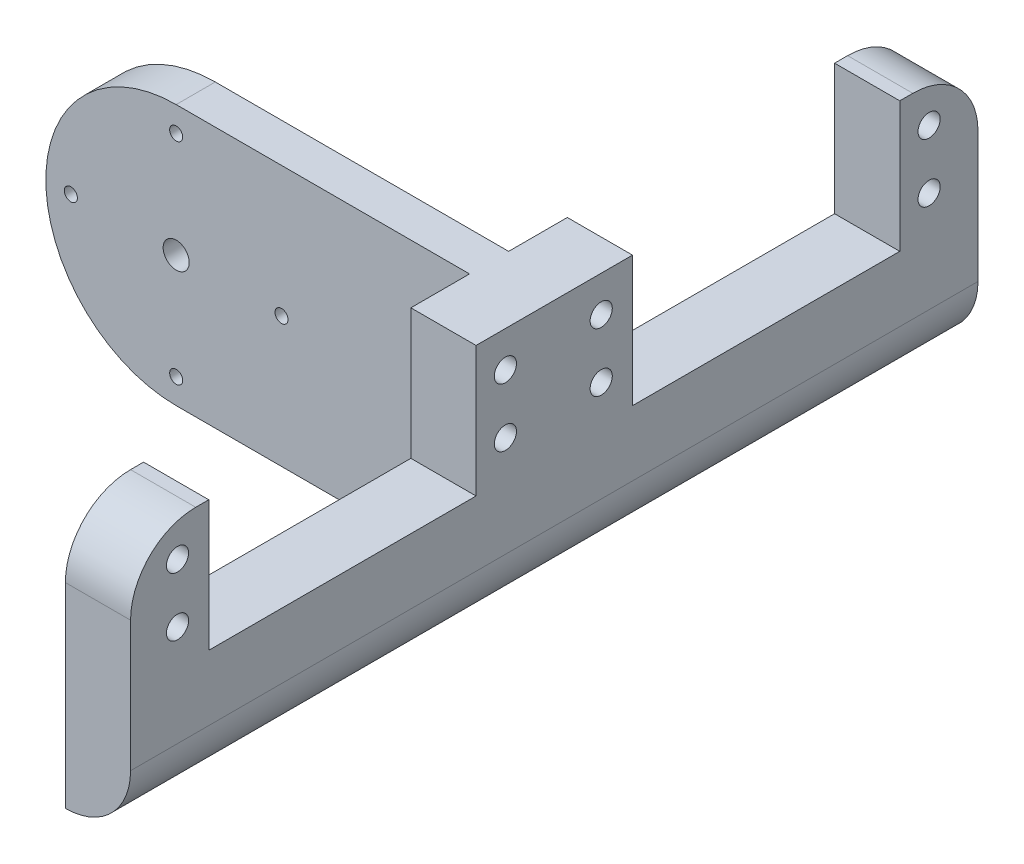
ISO-10303-21;
HEADER;
FILE_DESCRIPTION(('STEP AP214'),'2;1');
FILE_NAME('part.step','',(''),(''),'','','');
FILE_SCHEMA(('AUTOMOTIVE_DESIGN { 1 0 10303 214 1 1 1 1 }'));
ENDSEC;
DATA;
#1=APPLICATION_CONTEXT('core data for automotive mechanical design processes');
#2=APPLICATION_PROTOCOL_DEFINITION('international standard','automotive_design',2000,#1);
#3=PRODUCT_CONTEXT('',#1,'mechanical');
#4=PRODUCT('Part','Part','',(#3));
#5=PRODUCT_RELATED_PRODUCT_CATEGORY('part','',(#4));
#6=PRODUCT_DEFINITION_FORMATION('','',#4);
#7=PRODUCT_DEFINITION_CONTEXT('part definition',#1,'design');
#8=PRODUCT_DEFINITION('design','',#6,#7);
#9=PRODUCT_DEFINITION_SHAPE('','',#8);
#10=(LENGTH_UNIT() NAMED_UNIT(*) SI_UNIT(.MILLI.,.METRE.));
#11=(NAMED_UNIT(*) PLANE_ANGLE_UNIT() SI_UNIT($,.RADIAN.));
#12=(NAMED_UNIT(*) SI_UNIT($,.STERADIAN.) SOLID_ANGLE_UNIT());
#13=UNCERTAINTY_MEASURE_WITH_UNIT(LENGTH_MEASURE(1.E-05),#10,'distance_accuracy_value','');
#14=(GEOMETRIC_REPRESENTATION_CONTEXT(3) GLOBAL_UNCERTAINTY_ASSIGNED_CONTEXT((#13)) GLOBAL_UNIT_ASSIGNED_CONTEXT((#10,
#11,#12)) REPRESENTATION_CONTEXT('',''));
#15=CARTESIAN_POINT('',(0.,0.,0.));
#16=DIRECTION('',(0.,0.,1.));
#17=DIRECTION('',(1.,0.,0.));
#18=AXIS2_PLACEMENT_3D('',#15,#16,#17);
#19=CARTESIAN_POINT('',(55.,0.,0.));
#20=DIRECTION('',(-1.,0.,0.));
#21=DIRECTION('',(0.,0.,1.));
#22=AXIS2_PLACEMENT_3D('',#19,#20,#21);
#23=PLANE('',#22);
#24=CARTESIAN_POINT('',(55.,5.49999999999998,-57.5000000000002));
#25=DIRECTION('',(1.,0.,0.));
#26=DIRECTION('',(0.,0.,-1.));
#27=AXIS2_PLACEMENT_3D('',#24,#25,#26);
#28=CIRCLE('',#27,1.69999999999999);
#29=CARTESIAN_POINT('',(55.,5.49999999999998,-59.2000000000002));
#30=VERTEX_POINT('',#29);
#31=EDGE_CURVE('E737',#30,#30,#28,.T.);
#32=ORIENTED_EDGE('',*,*,#31,.F.);
#33=EDGE_LOOP('',(#32));
#34=FACE_BOUND('',#33,.T.);
#35=DIRECTION('',(0.,1.,0.));
#36=VECTOR('',#35,1.);
#37=CARTESIAN_POINT('',(55.,20.,-65.));
#38=LINE('',#37,#36);
#39=CARTESIAN_POINT('',(55.,-10.,-65.));
#40=VERTEX_POINT('',#39);
#41=CARTESIAN_POINT('',(55.,10.,-65.));
#42=VERTEX_POINT('',#41);
#43=EDGE_CURVE('E227',#40,#42,#38,.T.);
#44=ORIENTED_EDGE('',*,*,#43,.T.);
#45=CARTESIAN_POINT('',(55.,10.,-55.));
#46=DIRECTION('',(-1.,0.,0.));
#47=DIRECTION('',(0.,0.,1.));
#48=AXIS2_PLACEMENT_3D('',#45,#46,#47);
#49=CIRCLE('',#48,10.);
#50=CARTESIAN_POINT('',(55.,20.,-55.));
#51=VERTEX_POINT('',#50);
#52=EDGE_CURVE('E325',#42,#51,#49,.F.);
#53=ORIENTED_EDGE('',*,*,#52,.T.);
#54=DIRECTION('',(0.,0.,1.));
#55=VECTOR('',#54,1.);
#56=CARTESIAN_POINT('',(55.,20.,-65.));
#57=LINE('',#56,#55);
#58=CARTESIAN_POINT('',(55.,20.,-53.));
#59=VERTEX_POINT('',#58);
#60=EDGE_CURVE('E232',#51,#59,#57,.T.);
#61=ORIENTED_EDGE('',*,*,#60,.T.);
#62=DIRECTION('',(0.,1.,0.));
#63=VECTOR('',#62,1.);
#64=CARTESIAN_POINT('',(55.,0.,-53.));
#65=LINE('',#64,#63);
#66=CARTESIAN_POINT('',(55.,0.,-53.));
#67=VERTEX_POINT('',#66);
#68=EDGE_CURVE('E186',#67,#59,#65,.T.);
#69=ORIENTED_EDGE('',*,*,#68,.F.);
#70=DIRECTION('',(0.,0.,-1.));
#71=VECTOR('',#70,1.);
#72=CARTESIAN_POINT('',(55.,0.,-53.));
#73=LINE('',#72,#71);
#74=CARTESIAN_POINT('',(55.,0.,-12.));
#75=VERTEX_POINT('',#74);
#76=EDGE_CURVE('E166',#75,#67,#73,.T.);
#77=ORIENTED_EDGE('',*,*,#76,.F.);
#78=DIRECTION('',(0.,-1.,0.));
#79=VECTOR('',#78,1.);
#80=CARTESIAN_POINT('',(55.,0.,-12.));
#81=LINE('',#80,#79);
#82=CARTESIAN_POINT('',(55.,20.,-12.));
#83=VERTEX_POINT('',#82);
#84=EDGE_CURVE('E183',#83,#75,#81,.T.);
#85=ORIENTED_EDGE('',*,*,#84,.F.);
#86=CARTESIAN_POINT('',(55.,20.,12.));
#87=VERTEX_POINT('',#86);
#88=EDGE_CURVE('E235',#83,#87,#57,.T.);
#89=ORIENTED_EDGE('',*,*,#88,.T.);
#90=DIRECTION('',(0.,1.,0.));
#91=VECTOR('',#90,1.);
#92=CARTESIAN_POINT('',(55.,0.,12.));
#93=LINE('',#92,#91);
#94=CARTESIAN_POINT('',(55.,0.,12.));
#95=VERTEX_POINT('',#94);
#96=EDGE_CURVE('E206',#95,#87,#93,.T.);
#97=ORIENTED_EDGE('',*,*,#96,.F.);
#98=DIRECTION('',(0.,0.,-1.));
#99=VECTOR('',#98,1.);
#100=CARTESIAN_POINT('',(55.,0.,53.));
#101=LINE('',#100,#99);
#102=CARTESIAN_POINT('',(55.,0.,53.));
#103=VERTEX_POINT('',#102);
#104=EDGE_CURVE('E215',#103,#95,#101,.T.);
#105=ORIENTED_EDGE('',*,*,#104,.F.);
#106=DIRECTION('',(0.,-1.,0.));
#107=VECTOR('',#106,1.);
#108=CARTESIAN_POINT('',(55.,0.,53.));
#109=LINE('',#108,#107);
#110=CARTESIAN_POINT('',(55.,20.,53.));
#111=VERTEX_POINT('',#110);
#112=EDGE_CURVE('E213',#111,#103,#109,.T.);
#113=ORIENTED_EDGE('',*,*,#112,.F.);
#114=CARTESIAN_POINT('',(55.,20.,55.));
#115=VERTEX_POINT('',#114);
#116=EDGE_CURVE('E230',#111,#115,#57,.T.);
#117=ORIENTED_EDGE('',*,*,#116,.T.);
#118=CARTESIAN_POINT('',(55.,10.,55.));
#119=DIRECTION('',(-1.,0.,0.));
#120=DIRECTION('',(0.,0.,1.));
#121=AXIS2_PLACEMENT_3D('',#118,#119,#120);
#122=CIRCLE('',#121,10.);
#123=CARTESIAN_POINT('',(55.,10.,65.));
#124=VERTEX_POINT('',#123);
#125=EDGE_CURVE('E323',#115,#124,#122,.F.);
#126=ORIENTED_EDGE('',*,*,#125,.T.);
#127=DIRECTION('',(0.,-1.,0.));
#128=VECTOR('',#127,1.);
#129=CARTESIAN_POINT('',(55.,20.,65.));
#130=LINE('',#129,#128);
#131=CARTESIAN_POINT('',(55.,-10.,65.));
#132=VERTEX_POINT('',#131);
#133=EDGE_CURVE('E234',#124,#132,#130,.T.);
#134=ORIENTED_EDGE('',*,*,#133,.T.);
#135=DIRECTION('',(0.,0.,-1.));
#136=VECTOR('',#135,1.);
#137=CARTESIAN_POINT('',(55.,-10.,-65.));
#138=LINE('',#137,#136);
#139=EDGE_CURVE('E305',#132,#40,#138,.T.);
#140=ORIENTED_EDGE('',*,*,#139,.T.);
#141=EDGE_LOOP('',(#44,#53,#61,#69,#77,#85,#89,#97,#105,#113,#117,#126,#134,#140));
#142=FACE_BOUND('',#141,.T.);
#143=CARTESIAN_POINT('',(55.,14.5,-57.5000000000002));
#144=DIRECTION('',(1.,0.,0.));
#145=DIRECTION('',(0.,0.,-1.));
#146=AXIS2_PLACEMENT_3D('',#143,#144,#145);
#147=CIRCLE('',#146,1.69999999999999);
#148=CARTESIAN_POINT('',(55.,14.5,-59.2000000000002));
#149=VERTEX_POINT('',#148);
#150=EDGE_CURVE('E732',#149,#149,#147,.T.);
#151=ORIENTED_EDGE('',*,*,#150,.F.);
#152=EDGE_LOOP('',(#151));
#153=FACE_BOUND('',#152,.T.);
#154=CARTESIAN_POINT('',(55.,5.49999999999982,-7.20000000000001));
#155=DIRECTION('',(1.,0.,0.));
#156=DIRECTION('',(0.,0.,-1.));
#157=AXIS2_PLACEMENT_3D('',#154,#155,#156);
#158=CIRCLE('',#157,1.69999999999999);
#159=CARTESIAN_POINT('',(55.,5.49999999999982,-8.9));
#160=VERTEX_POINT('',#159);
#161=EDGE_CURVE('E726',#160,#160,#158,.T.);
#162=ORIENTED_EDGE('',*,*,#161,.F.);
#163=EDGE_LOOP('',(#162));
#164=FACE_BOUND('',#163,.T.);
#165=CARTESIAN_POINT('',(55.,14.4999999999999,-7.19999999999998));
#166=DIRECTION('',(1.,0.,0.));
#167=DIRECTION('',(0.,0.,-1.));
#168=AXIS2_PLACEMENT_3D('',#165,#166,#167);
#169=CIRCLE('',#168,1.69999999999999);
#170=CARTESIAN_POINT('',(55.,14.4999999999999,-8.89999999999996));
#171=VERTEX_POINT('',#170);
#172=EDGE_CURVE('E714',#171,#171,#169,.T.);
#173=ORIENTED_EDGE('',*,*,#172,.F.);
#174=EDGE_LOOP('',(#173));
#175=FACE_BOUND('',#174,.T.);
#176=CARTESIAN_POINT('',(55.,5.49999999999998,7.49999999999999));
#177=DIRECTION('',(1.,0.,0.));
#178=DIRECTION('',(0.,0.,-1.));
#179=AXIS2_PLACEMENT_3D('',#176,#177,#178);
#180=CIRCLE('',#179,1.69999999999999);
#181=CARTESIAN_POINT('',(55.,5.49999999999998,5.80000000000001));
#182=VERTEX_POINT('',#181);
#183=EDGE_CURVE('E715',#182,#182,#180,.T.);
#184=ORIENTED_EDGE('',*,*,#183,.F.);
#185=EDGE_LOOP('',(#184));
#186=FACE_BOUND('',#185,.T.);
#187=CARTESIAN_POINT('',(55.,14.5,7.49999999999999));
#188=DIRECTION('',(1.,0.,0.));
#189=DIRECTION('',(0.,0.,-1.));
#190=AXIS2_PLACEMENT_3D('',#187,#188,#189);
#191=CIRCLE('',#190,1.69999999999999);
#192=CARTESIAN_POINT('',(55.,14.5,5.80000000000001));
#193=VERTEX_POINT('',#192);
#194=EDGE_CURVE('E757',#193,#193,#191,.T.);
#195=ORIENTED_EDGE('',*,*,#194,.F.);
#196=EDGE_LOOP('',(#195));
#197=FACE_BOUND('',#196,.T.);
#198=CARTESIAN_POINT('',(55.,5.4999999999996,57.8000000000001));
#199=DIRECTION('',(1.,0.,0.));
#200=DIRECTION('',(0.,0.,-1.));
#201=AXIS2_PLACEMENT_3D('',#198,#199,#200);
#202=CIRCLE('',#201,1.69999999999999);
#203=CARTESIAN_POINT('',(55.,5.4999999999996,56.1000000000002));
#204=VERTEX_POINT('',#203);
#205=EDGE_CURVE('E761',#204,#204,#202,.T.);
#206=ORIENTED_EDGE('',*,*,#205,.F.);
#207=EDGE_LOOP('',(#206));
#208=FACE_BOUND('',#207,.T.);
#209=CARTESIAN_POINT('',(55.,14.4999999999996,57.8000000000001));
#210=DIRECTION('',(1.,0.,0.));
#211=DIRECTION('',(0.,0.,-1.));
#212=AXIS2_PLACEMENT_3D('',#209,#210,#211);
#213=CIRCLE('',#212,1.69999999999999);
#214=CARTESIAN_POINT('',(55.,14.4999999999996,56.1000000000002));
#215=VERTEX_POINT('',#214);
#216=EDGE_CURVE('E763',#215,#215,#213,.T.);
#217=ORIENTED_EDGE('',*,*,#216,.F.);
#218=EDGE_LOOP('',(#217));
#219=FACE_BOUND('',#218,.T.);
#220=ADVANCED_FACE('F35',(#34,#142,#153,#164,#175,#186,#197,#208,#219),#23,.F.);
#221=CARTESIAN_POINT('',(0.,20.,-3.));
#222=DIRECTION('',(0.,1.,0.));
#223=DIRECTION('',(0.,0.,1.));
#224=AXIS2_PLACEMENT_3D('',#221,#222,#223);
#225=PLANE('',#224);
#226=DIRECTION('',(1.,0.,0.));
#227=VECTOR('',#226,1.);
#228=CARTESIAN_POINT('',(45.,20.,-12.));
#229=LINE('',#228,#227);
#230=CARTESIAN_POINT('',(45.,20.,-12.));
#231=VERTEX_POINT('',#230);
#232=EDGE_CURVE('E199',#231,#83,#229,.T.);
#233=ORIENTED_EDGE('',*,*,#232,.F.);
#234=DIRECTION('',(0.,0.,1.));
#235=VECTOR('',#234,1.);
#236=CARTESIAN_POINT('',(45.,20.,-65.));
#237=LINE('',#236,#235);
#238=CARTESIAN_POINT('',(45.,20.,-3.));
#239=VERTEX_POINT('',#238);
#240=EDGE_CURVE('E244',#231,#239,#237,.T.);
#241=ORIENTED_EDGE('',*,*,#240,.T.);
#242=DIRECTION('',(-1.,0.,0.));
#243=VECTOR('',#242,1.);
#244=CARTESIAN_POINT('',(0.,20.,-3.));
#245=LINE('',#244,#243);
#246=CARTESIAN_POINT('',(0.,20.,-3.));
#247=VERTEX_POINT('',#246);
#248=EDGE_CURVE('E299',#239,#247,#245,.T.);
#249=ORIENTED_EDGE('',*,*,#248,.T.);
#250=DIRECTION('',(0.,0.,1.));
#251=VECTOR('',#250,1.);
#252=CARTESIAN_POINT('',(0.,20.,-3.));
#253=LINE('',#252,#251);
#254=CARTESIAN_POINT('',(0.,20.,3.));
#255=VERTEX_POINT('',#254);
#256=EDGE_CURVE('E303',#247,#255,#253,.T.);
#257=ORIENTED_EDGE('',*,*,#256,.T.);
#258=DIRECTION('',(-1.,0.,0.));
#259=VECTOR('',#258,1.);
#260=CARTESIAN_POINT('',(0.,20.,3.));
#261=LINE('',#260,#259);
#262=CARTESIAN_POINT('',(45.,20.,3.));
#263=VERTEX_POINT('',#262);
#264=EDGE_CURVE('E272',#263,#255,#261,.T.);
#265=ORIENTED_EDGE('',*,*,#264,.F.);
#266=CARTESIAN_POINT('',(45.,20.,12.));
#267=VERTEX_POINT('',#266);
#268=EDGE_CURVE('E245',#263,#267,#237,.T.);
#269=ORIENTED_EDGE('',*,*,#268,.T.);
#270=DIRECTION('',(1.,0.,0.));
#271=VECTOR('',#270,1.);
#272=CARTESIAN_POINT('',(45.,20.,12.));
#273=LINE('',#272,#271);
#274=EDGE_CURVE('E220',#267,#87,#273,.T.);
#275=ORIENTED_EDGE('',*,*,#274,.T.);
#276=ORIENTED_EDGE('',*,*,#88,.F.);
#277=EDGE_LOOP('',(#233,#241,#249,#257,#265,#269,#275,#276));
#278=FACE_BOUND('',#277,.T.);
#279=ADVANCED_FACE('F386',(#278),#225,.T.);
#280=CARTESIAN_POINT('',(45.,20.,53.));
#281=VERTEX_POINT('',#280);
#282=CARTESIAN_POINT('',(45.,20.,55.));
#283=VERTEX_POINT('',#282);
#284=EDGE_CURVE('E240',#281,#283,#237,.T.);
#285=ORIENTED_EDGE('',*,*,#284,.T.);
#286=DIRECTION('',(-1.,0.,0.));
#287=VECTOR('',#286,1.);
#288=CARTESIAN_POINT('',(55.,20.,55.));
#289=LINE('',#288,#287);
#290=EDGE_CURVE('E11',#283,#115,#289,.F.);
#291=ORIENTED_EDGE('',*,*,#290,.T.);
#292=ORIENTED_EDGE('',*,*,#116,.F.);
#293=DIRECTION('',(1.,0.,0.));
#294=VECTOR('',#293,1.);
#295=CARTESIAN_POINT('',(45.,20.,53.));
#296=LINE('',#295,#294);
#297=EDGE_CURVE('E194',#281,#111,#296,.T.);
#298=ORIENTED_EDGE('',*,*,#297,.F.);
#299=EDGE_LOOP('',(#285,#291,#292,#298));
#300=FACE_BOUND('',#299,.T.);
#301=ADVANCED_FACE('F377',(#300),#225,.T.);
#302=CARTESIAN_POINT('',(0.,0.,-3.));
#303=DIRECTION('',(0.,0.,1.));
#304=DIRECTION('',(1.,0.,0.));
#305=AXIS2_PLACEMENT_3D('',#302,#303,#304);
#306=CYLINDRICAL_SURFACE('',#305,20.);
#307=DIRECTION('',(0.,0.,1.));
#308=VECTOR('',#307,1.);
#309=CARTESIAN_POINT('',(0.,-20.,-3.));
#310=LINE('',#309,#308);
#311=CARTESIAN_POINT('',(0.,-20.,-3.));
#312=VERTEX_POINT('',#311);
#313=CARTESIAN_POINT('',(0.,-20.,3.));
#314=VERTEX_POINT('',#313);
#315=EDGE_CURVE('E302',#312,#314,#310,.T.);
#316=ORIENTED_EDGE('',*,*,#315,.T.);
#317=CARTESIAN_POINT('',(0.,0.,3.));
#318=DIRECTION('',(0.,0.,1.));
#319=DIRECTION('',(1.,0.,0.));
#320=AXIS2_PLACEMENT_3D('',#317,#318,#319);
#321=CIRCLE('',#320,20.);
#322=EDGE_CURVE('E264',#255,#314,#321,.T.);
#323=ORIENTED_EDGE('',*,*,#322,.F.);
#324=ORIENTED_EDGE('',*,*,#256,.F.);
#325=CARTESIAN_POINT('',(0.,0.,-3.));
#326=DIRECTION('',(0.,0.,1.));
#327=DIRECTION('',(1.,0.,0.));
#328=AXIS2_PLACEMENT_3D('',#325,#326,#327);
#329=CIRCLE('',#328,20.);
#330=EDGE_CURVE('E290',#247,#312,#329,.T.);
#331=ORIENTED_EDGE('',*,*,#330,.T.);
#332=EDGE_LOOP('',(#316,#323,#324,#331));
#333=FACE_BOUND('',#332,.T.);
#334=ADVANCED_FACE('F367',(#333),#306,.T.);
#335=ORIENTED_EDGE('',*,*,#60,.F.);
#336=DIRECTION('',(-1.,0.,0.));
#337=VECTOR('',#336,1.);
#338=CARTESIAN_POINT('',(45.,20.,-55.));
#339=LINE('',#338,#337);
#340=CARTESIAN_POINT('',(45.,20.,-55.));
#341=VERTEX_POINT('',#340);
#342=EDGE_CURVE('E316',#51,#341,#339,.T.);
#343=ORIENTED_EDGE('',*,*,#342,.T.);
#344=CARTESIAN_POINT('',(45.,20.,-53.));
#345=VERTEX_POINT('',#344);
#346=EDGE_CURVE('E241',#341,#345,#237,.T.);
#347=ORIENTED_EDGE('',*,*,#346,.T.);
#348=DIRECTION('',(1.,0.,0.));
#349=VECTOR('',#348,1.);
#350=CARTESIAN_POINT('',(45.,20.,-53.));
#351=LINE('',#350,#349);
#352=EDGE_CURVE('E170',#345,#59,#351,.T.);
#353=ORIENTED_EDGE('',*,*,#352,.T.);
#354=EDGE_LOOP('',(#335,#343,#347,#353));
#355=FACE_BOUND('',#354,.T.);
#356=ADVANCED_FACE('F355',(#355),#225,.T.);
#357=CARTESIAN_POINT('',(0.,-20.,-3.));
#358=DIRECTION('',(0.,-1.,0.));
#359=DIRECTION('',(0.,0.,-1.));
#360=AXIS2_PLACEMENT_3D('',#357,#358,#359);
#361=PLANE('',#360);
#362=DIRECTION('',(1.,0.,0.));
#363=VECTOR('',#362,1.);
#364=CARTESIAN_POINT('',(0.,-20.,-3.));
#365=LINE('',#364,#363);
#366=CARTESIAN_POINT('',(45.,-20.,-3.));
#367=VERTEX_POINT('',#366);
#368=EDGE_CURVE('E293',#312,#367,#365,.T.);
#369=ORIENTED_EDGE('',*,*,#368,.T.);
#370=DIRECTION('',(0.,0.,-1.));
#371=VECTOR('',#370,1.);
#372=CARTESIAN_POINT('',(45.,-20.,65.));
#373=LINE('',#372,#371);
#374=CARTESIAN_POINT('',(45.,-20.,3.));
#375=VERTEX_POINT('',#374);
#376=EDGE_CURVE('E311',#367,#375,#373,.F.);
#377=ORIENTED_EDGE('',*,*,#376,.T.);
#378=DIRECTION('',(1.,0.,0.));
#379=VECTOR('',#378,1.);
#380=CARTESIAN_POINT('',(0.,-20.,3.));
#381=LINE('',#380,#379);
#382=EDGE_CURVE('E267',#314,#375,#381,.T.);
#383=ORIENTED_EDGE('',*,*,#382,.F.);
#384=ORIENTED_EDGE('',*,*,#315,.F.);
#385=EDGE_LOOP('',(#369,#377,#383,#384));
#386=FACE_BOUND('',#385,.T.);
#387=ADVANCED_FACE('F359',(#386),#361,.T.);
#388=CARTESIAN_POINT('',(0.,0.,-3.));
#389=DIRECTION('',(0.,0.,1.));
#390=DIRECTION('',(1.,0.,0.));
#391=AXIS2_PLACEMENT_3D('',#388,#389,#390);
#392=PLANE('',#391);
#393=CARTESIAN_POINT('',(-16.16,0.,-3.));
#394=DIRECTION('',(0.,0.,1.));
#395=DIRECTION('',(1.,0.,0.));
#396=AXIS2_PLACEMENT_3D('',#393,#394,#395);
#397=CIRCLE('',#396,1.);
#398=CARTESIAN_POINT('',(-15.16,0.,-3.));
#399=VERTEX_POINT('',#398);
#400=EDGE_CURVE('E275',#399,#399,#397,.T.);
#401=ORIENTED_EDGE('',*,*,#400,.T.);
#402=EDGE_LOOP('',(#401));
#403=FACE_BOUND('',#402,.T.);
#404=CARTESIAN_POINT('',(0.,-16.16,-3.));
#405=DIRECTION('',(0.,0.,1.));
#406=DIRECTION('',(1.,0.,0.));
#407=AXIS2_PLACEMENT_3D('',#404,#405,#406);
#408=CIRCLE('',#407,1.);
#409=CARTESIAN_POINT('',(1.,-16.16,-3.));
#410=VERTEX_POINT('',#409);
#411=EDGE_CURVE('E278',#410,#410,#408,.T.);
#412=ORIENTED_EDGE('',*,*,#411,.T.);
#413=EDGE_LOOP('',(#412));
#414=FACE_BOUND('',#413,.T.);
#415=CARTESIAN_POINT('',(16.16,0.,-3.));
#416=DIRECTION('',(0.,0.,1.));
#417=DIRECTION('',(1.,0.,0.));
#418=AXIS2_PLACEMENT_3D('',#415,#416,#417);
#419=CIRCLE('',#418,1.);
#420=CARTESIAN_POINT('',(17.16,0.,-3.));
#421=VERTEX_POINT('',#420);
#422=EDGE_CURVE('E281',#421,#421,#419,.T.);
#423=ORIENTED_EDGE('',*,*,#422,.T.);
#424=EDGE_LOOP('',(#423));
#425=FACE_BOUND('',#424,.T.);
#426=CARTESIAN_POINT('',(0.,16.16,-3.));
#427=DIRECTION('',(0.,0.,1.));
#428=DIRECTION('',(1.,0.,0.));
#429=AXIS2_PLACEMENT_3D('',#426,#427,#428);
#430=CIRCLE('',#429,1.);
#431=CARTESIAN_POINT('',(1.,16.16,-3.));
#432=VERTEX_POINT('',#431);
#433=EDGE_CURVE('E284',#432,#432,#430,.T.);
#434=ORIENTED_EDGE('',*,*,#433,.T.);
#435=EDGE_LOOP('',(#434));
#436=FACE_BOUND('',#435,.T.);
#437=CARTESIAN_POINT('',(0.,0.,-3.));
#438=DIRECTION('',(0.,0.,1.));
#439=DIRECTION('',(1.,0.,0.));
#440=AXIS2_PLACEMENT_3D('',#437,#438,#439);
#441=CIRCLE('',#440,2.);
#442=CARTESIAN_POINT('',(2.,0.,-3.));
#443=VERTEX_POINT('',#442);
#444=EDGE_CURVE('E287',#443,#443,#441,.T.);
#445=ORIENTED_EDGE('',*,*,#444,.T.);
#446=EDGE_LOOP('',(#445));
#447=FACE_BOUND('',#446,.T.);
#448=ORIENTED_EDGE('',*,*,#330,.F.);
#449=ORIENTED_EDGE('',*,*,#248,.F.);
#450=DIRECTION('',(0.,1.,0.));
#451=VECTOR('',#450,1.);
#452=CARTESIAN_POINT('',(45.,20.,-3.));
#453=LINE('',#452,#451);
#454=EDGE_CURVE('E296',#367,#239,#453,.T.);
#455=ORIENTED_EDGE('',*,*,#454,.F.);
#456=ORIENTED_EDGE('',*,*,#368,.F.);
#457=EDGE_LOOP('',(#448,#449,#455,#456));
#458=FACE_BOUND('',#457,.T.);
#459=ADVANCED_FACE('F370',(#403,#414,#425,#436,#447,#458),#392,.F.);
#460=CARTESIAN_POINT('',(0.,0.,-3.));
#461=DIRECTION('',(0.,0.,1.));
#462=DIRECTION('',(1.,0.,0.));
#463=AXIS2_PLACEMENT_3D('',#460,#461,#462);
#464=CYLINDRICAL_SURFACE('',#463,2.);
#465=ORIENTED_EDGE('',*,*,#444,.F.);
#466=EDGE_LOOP('',(#465));
#467=FACE_BOUND('',#466,.T.);
#468=CARTESIAN_POINT('',(0.,0.,3.));
#469=DIRECTION('',(0.,0.,1.));
#470=DIRECTION('',(1.,0.,0.));
#471=AXIS2_PLACEMENT_3D('',#468,#469,#470);
#472=CIRCLE('',#471,2.);
#473=CARTESIAN_POINT('',(2.,0.,3.));
#474=VERTEX_POINT('',#473);
#475=EDGE_CURVE('E261',#474,#474,#472,.T.);
#476=ORIENTED_EDGE('',*,*,#475,.T.);
#477=EDGE_LOOP('',(#476));
#478=FACE_BOUND('',#477,.T.);
#479=ADVANCED_FACE('F439',(#467,#478),#464,.F.);
#480=CARTESIAN_POINT('',(0.,16.16,-3.));
#481=DIRECTION('',(0.,0.,1.));
#482=DIRECTION('',(1.,0.,0.));
#483=AXIS2_PLACEMENT_3D('',#480,#481,#482);
#484=CYLINDRICAL_SURFACE('',#483,1.);
#485=ORIENTED_EDGE('',*,*,#433,.F.);
#486=EDGE_LOOP('',(#485));
#487=FACE_BOUND('',#486,.T.);
#488=CARTESIAN_POINT('',(0.,16.16,3.));
#489=DIRECTION('',(0.,0.,1.));
#490=DIRECTION('',(1.,0.,0.));
#491=AXIS2_PLACEMENT_3D('',#488,#489,#490);
#492=CIRCLE('',#491,1.);
#493=CARTESIAN_POINT('',(1.,16.16,3.));
#494=VERTEX_POINT('',#493);
#495=EDGE_CURVE('E258',#494,#494,#492,.T.);
#496=ORIENTED_EDGE('',*,*,#495,.T.);
#497=EDGE_LOOP('',(#496));
#498=FACE_BOUND('',#497,.T.);
#499=ADVANCED_FACE('F435',(#487,#498),#484,.F.);
#500=CARTESIAN_POINT('',(16.16,0.,-3.));
#501=DIRECTION('',(0.,0.,1.));
#502=DIRECTION('',(1.,0.,0.));
#503=AXIS2_PLACEMENT_3D('',#500,#501,#502);
#504=CYLINDRICAL_SURFACE('',#503,1.);
#505=ORIENTED_EDGE('',*,*,#422,.F.);
#506=EDGE_LOOP('',(#505));
#507=FACE_BOUND('',#506,.T.);
#508=CARTESIAN_POINT('',(16.16,0.,3.));
#509=DIRECTION('',(0.,0.,1.));
#510=DIRECTION('',(1.,0.,0.));
#511=AXIS2_PLACEMENT_3D('',#508,#509,#510);
#512=CIRCLE('',#511,1.);
#513=CARTESIAN_POINT('',(17.16,0.,3.));
#514=VERTEX_POINT('',#513);
#515=EDGE_CURVE('E255',#514,#514,#512,.T.);
#516=ORIENTED_EDGE('',*,*,#515,.T.);
#517=EDGE_LOOP('',(#516));
#518=FACE_BOUND('',#517,.T.);
#519=ADVANCED_FACE('F431',(#507,#518),#504,.F.);
#520=CARTESIAN_POINT('',(0.,-16.16,-3.));
#521=DIRECTION('',(0.,0.,1.));
#522=DIRECTION('',(1.,0.,0.));
#523=AXIS2_PLACEMENT_3D('',#520,#521,#522);
#524=CYLINDRICAL_SURFACE('',#523,1.);
#525=ORIENTED_EDGE('',*,*,#411,.F.);
#526=EDGE_LOOP('',(#525));
#527=FACE_BOUND('',#526,.T.);
#528=CARTESIAN_POINT('',(0.,-16.16,3.));
#529=DIRECTION('',(0.,0.,1.));
#530=DIRECTION('',(1.,0.,0.));
#531=AXIS2_PLACEMENT_3D('',#528,#529,#530);
#532=CIRCLE('',#531,1.);
#533=CARTESIAN_POINT('',(1.,-16.16,3.));
#534=VERTEX_POINT('',#533);
#535=EDGE_CURVE('E252',#534,#534,#532,.T.);
#536=ORIENTED_EDGE('',*,*,#535,.T.);
#537=EDGE_LOOP('',(#536));
#538=FACE_BOUND('',#537,.T.);
#539=ADVANCED_FACE('F427',(#527,#538),#524,.F.);
#540=CARTESIAN_POINT('',(-16.16,0.,-3.));
#541=DIRECTION('',(0.,0.,1.));
#542=DIRECTION('',(1.,0.,0.));
#543=AXIS2_PLACEMENT_3D('',#540,#541,#542);
#544=CYLINDRICAL_SURFACE('',#543,1.);
#545=ORIENTED_EDGE('',*,*,#400,.F.);
#546=EDGE_LOOP('',(#545));
#547=FACE_BOUND('',#546,.T.);
#548=CARTESIAN_POINT('',(-16.16,0.,3.));
#549=DIRECTION('',(0.,0.,1.));
#550=DIRECTION('',(1.,0.,0.));
#551=AXIS2_PLACEMENT_3D('',#548,#549,#550);
#552=CIRCLE('',#551,1.);
#553=CARTESIAN_POINT('',(-15.16,0.,3.));
#554=VERTEX_POINT('',#553);
#555=EDGE_CURVE('E237',#554,#554,#552,.T.);
#556=ORIENTED_EDGE('',*,*,#555,.T.);
#557=EDGE_LOOP('',(#556));
#558=FACE_BOUND('',#557,.T.);
#559=ADVANCED_FACE('F423',(#547,#558),#544,.F.);
#560=CARTESIAN_POINT('',(0.,0.,3.));
#561=DIRECTION('',(0.,0.,1.));
#562=DIRECTION('',(1.,0.,0.));
#563=AXIS2_PLACEMENT_3D('',#560,#561,#562);
#564=PLANE('',#563);
#565=ORIENTED_EDGE('',*,*,#535,.F.);
#566=EDGE_LOOP('',(#565));
#567=FACE_BOUND('',#566,.T.);
#568=ORIENTED_EDGE('',*,*,#495,.F.);
#569=EDGE_LOOP('',(#568));
#570=FACE_BOUND('',#569,.T.);
#571=ORIENTED_EDGE('',*,*,#322,.T.);
#572=ORIENTED_EDGE('',*,*,#382,.T.);
#573=DIRECTION('',(0.,1.,0.));
#574=VECTOR('',#573,1.);
#575=CARTESIAN_POINT('',(45.,20.,3.));
#576=LINE('',#575,#574);
#577=EDGE_CURVE('E270',#375,#263,#576,.T.);
#578=ORIENTED_EDGE('',*,*,#577,.T.);
#579=ORIENTED_EDGE('',*,*,#264,.T.);
#580=EDGE_LOOP('',(#571,#572,#578,#579));
#581=FACE_BOUND('',#580,.T.);
#582=ORIENTED_EDGE('',*,*,#475,.F.);
#583=EDGE_LOOP('',(#582));
#584=FACE_BOUND('',#583,.T.);
#585=ORIENTED_EDGE('',*,*,#515,.F.);
#586=EDGE_LOOP('',(#585));
#587=FACE_BOUND('',#586,.T.);
#588=ORIENTED_EDGE('',*,*,#555,.F.);
#589=EDGE_LOOP('',(#588));
#590=FACE_BOUND('',#589,.T.);
#591=ADVANCED_FACE('F362',(#567,#570,#581,#584,#587,#590),#564,.T.);
#592=CARTESIAN_POINT('',(45.,0.,0.));
#593=DIRECTION('',(-1.,0.,0.));
#594=DIRECTION('',(0.,0.,1.));
#595=AXIS2_PLACEMENT_3D('',#592,#593,#594);
#596=PLANE('',#595);
#597=CARTESIAN_POINT('',(45.,14.4999999999996,57.8000000000001));
#598=DIRECTION('',(-1.,0.,0.));
#599=DIRECTION('',(0.,0.,1.));
#600=AXIS2_PLACEMENT_3D('',#597,#598,#599);
#601=CIRCLE('',#600,1.69999999999999);
#602=CARTESIAN_POINT('',(45.,14.4999999999996,59.5000000000001));
#603=VERTEX_POINT('',#602);
#604=EDGE_CURVE('E701',#603,#603,#601,.T.);
#605=ORIENTED_EDGE('',*,*,#604,.F.);
#606=EDGE_LOOP('',(#605));
#607=FACE_BOUND('',#606,.T.);
#608=CARTESIAN_POINT('',(45.,5.4999999999996,57.8000000000001));
#609=DIRECTION('',(-1.,0.,0.));
#610=DIRECTION('',(0.,0.,1.));
#611=AXIS2_PLACEMENT_3D('',#608,#609,#610);
#612=CIRCLE('',#611,1.69999999999999);
#613=CARTESIAN_POINT('',(45.,5.4999999999996,59.5000000000001));
#614=VERTEX_POINT('',#613);
#615=EDGE_CURVE('E705',#614,#614,#612,.T.);
#616=ORIENTED_EDGE('',*,*,#615,.F.);
#617=EDGE_LOOP('',(#616));
#618=FACE_BOUND('',#617,.T.);
#619=CARTESIAN_POINT('',(45.,14.5,7.49999999999999));
#620=DIRECTION('',(-1.,0.,0.));
#621=DIRECTION('',(0.,0.,1.));
#622=AXIS2_PLACEMENT_3D('',#619,#620,#621);
#623=CIRCLE('',#622,1.69999999999999);
#624=CARTESIAN_POINT('',(45.,14.5,9.19999999999999));
#625=VERTEX_POINT('',#624);
#626=EDGE_CURVE('E709',#625,#625,#623,.T.);
#627=ORIENTED_EDGE('',*,*,#626,.F.);
#628=EDGE_LOOP('',(#627));
#629=FACE_BOUND('',#628,.T.);
#630=CARTESIAN_POINT('',(45.,5.49999999999998,7.49999999999999));
#631=DIRECTION('',(-1.,0.,0.));
#632=DIRECTION('',(0.,0.,1.));
#633=AXIS2_PLACEMENT_3D('',#630,#631,#632);
#634=CIRCLE('',#633,1.69999999999999);
#635=CARTESIAN_POINT('',(45.,5.49999999999998,9.19999999999999));
#636=VERTEX_POINT('',#635);
#637=EDGE_CURVE('E712',#636,#636,#634,.T.);
#638=ORIENTED_EDGE('',*,*,#637,.F.);
#639=EDGE_LOOP('',(#638));
#640=FACE_BOUND('',#639,.T.);
#641=DIRECTION('',(0.,-1.,0.));
#642=VECTOR('',#641,1.);
#643=CARTESIAN_POINT('',(45.,20.,65.));
#644=LINE('',#643,#642);
#645=CARTESIAN_POINT('',(45.,10.,65.));
#646=VERTEX_POINT('',#645);
#647=CARTESIAN_POINT('',(45.,-20.,65.));
#648=VERTEX_POINT('',#647);
#649=EDGE_CURVE('E243',#646,#648,#644,.T.);
#650=ORIENTED_EDGE('',*,*,#649,.F.);
#651=CARTESIAN_POINT('',(45.,10.,55.));
#652=DIRECTION('',(-1.,0.,0.));
#653=DIRECTION('',(0.,0.,1.));
#654=AXIS2_PLACEMENT_3D('',#651,#652,#653);
#655=CIRCLE('',#654,10.);
#656=EDGE_CURVE('E43',#646,#283,#655,.T.);
#657=ORIENTED_EDGE('',*,*,#656,.T.);
#658=ORIENTED_EDGE('',*,*,#284,.F.);
#659=DIRECTION('',(0.,-1.,0.));
#660=VECTOR('',#659,1.);
#661=CARTESIAN_POINT('',(45.,0.,53.));
#662=LINE('',#661,#660);
#663=CARTESIAN_POINT('',(45.,0.,53.));
#664=VERTEX_POINT('',#663);
#665=EDGE_CURVE('E202',#281,#664,#662,.T.);
#666=ORIENTED_EDGE('',*,*,#665,.T.);
#667=DIRECTION('',(0.,0.,-1.));
#668=VECTOR('',#667,1.);
#669=CARTESIAN_POINT('',(45.,0.,53.));
#670=LINE('',#669,#668);
#671=CARTESIAN_POINT('',(45.,0.,12.));
#672=VERTEX_POINT('',#671);
#673=EDGE_CURVE('E205',#664,#672,#670,.T.);
#674=ORIENTED_EDGE('',*,*,#673,.T.);
#675=DIRECTION('',(0.,1.,0.));
#676=VECTOR('',#675,1.);
#677=CARTESIAN_POINT('',(45.,0.,12.));
#678=LINE('',#677,#676);
#679=EDGE_CURVE('E209',#672,#267,#678,.T.);
#680=ORIENTED_EDGE('',*,*,#679,.T.);
#681=ORIENTED_EDGE('',*,*,#268,.F.);
#682=ORIENTED_EDGE('',*,*,#577,.F.);
#683=DIRECTION('',(0.,0.,-1.));
#684=VECTOR('',#683,1.);
#685=CARTESIAN_POINT('',(45.,-20.,-65.));
#686=LINE('',#685,#684);
#687=EDGE_CURVE('E231',#648,#375,#686,.T.);
#688=ORIENTED_EDGE('',*,*,#687,.F.);
#689=EDGE_LOOP('',(#650,#657,#658,#666,#674,#680,#681,#682,#688));
#690=FACE_BOUND('',#689,.T.);
#691=ADVANCED_FACE('F333',(#607,#618,#629,#640,#690),#596,.T.);
#692=CARTESIAN_POINT('',(55.,20.,-65.));
#693=DIRECTION('',(0.,0.,1.));
#694=DIRECTION('',(0.,-1.,0.));
#695=AXIS2_PLACEMENT_3D('',#692,#693,#694);
#696=PLANE('',#695);
#697=DIRECTION('',(0.,1.,0.));
#698=VECTOR('',#697,1.);
#699=CARTESIAN_POINT('',(45.,20.,-65.));
#700=LINE('',#699,#698);
#701=CARTESIAN_POINT('',(45.,-20.,-65.));
#702=VERTEX_POINT('',#701);
#703=CARTESIAN_POINT('',(45.,10.,-65.));
#704=VERTEX_POINT('',#703);
#705=EDGE_CURVE('E198',#702,#704,#700,.T.);
#706=ORIENTED_EDGE('',*,*,#705,.T.);
#707=DIRECTION('',(-1.,0.,0.));
#708=VECTOR('',#707,1.);
#709=CARTESIAN_POINT('',(55.,10.,-65.));
#710=LINE('',#709,#708);
#711=EDGE_CURVE('E321',#704,#42,#710,.F.);
#712=ORIENTED_EDGE('',*,*,#711,.T.);
#713=ORIENTED_EDGE('',*,*,#43,.F.);
#714=CARTESIAN_POINT('',(45.,-10.,-65.));
#715=DIRECTION('',(0.,0.,1.));
#716=DIRECTION('',(0.,-1.,0.));
#717=AXIS2_PLACEMENT_3D('',#714,#715,#716);
#718=CIRCLE('',#717,10.);
#719=EDGE_CURVE('E309',#40,#702,#718,.F.);
#720=ORIENTED_EDGE('',*,*,#719,.T.);
#721=EDGE_LOOP('',(#706,#712,#713,#720));
#722=FACE_BOUND('',#721,.T.);
#723=ADVANCED_FACE('F347',(#722),#696,.F.);
#724=CARTESIAN_POINT('',(55.,20.,65.));
#725=DIRECTION('',(0.,0.,-1.));
#726=DIRECTION('',(0.,1.,0.));
#727=AXIS2_PLACEMENT_3D('',#724,#725,#726);
#728=PLANE('',#727);
#729=ORIENTED_EDGE('',*,*,#133,.F.);
#730=DIRECTION('',(-1.,0.,0.));
#731=VECTOR('',#730,1.);
#732=CARTESIAN_POINT('',(45.,10.,65.));
#733=LINE('',#732,#731);
#734=EDGE_CURVE('E327',#124,#646,#733,.T.);
#735=ORIENTED_EDGE('',*,*,#734,.T.);
#736=ORIENTED_EDGE('',*,*,#649,.T.);
#737=CARTESIAN_POINT('',(45.,-10.,65.));
#738=DIRECTION('',(0.,0.,-1.));
#739=DIRECTION('',(0.,1.,0.));
#740=AXIS2_PLACEMENT_3D('',#737,#738,#739);
#741=CIRCLE('',#740,10.);
#742=EDGE_CURVE('E313',#648,#132,#741,.F.);
#743=ORIENTED_EDGE('',*,*,#742,.T.);
#744=EDGE_LOOP('',(#729,#735,#736,#743));
#745=FACE_BOUND('',#744,.T.);
#746=ADVANCED_FACE('F330',(#745),#728,.F.);
#747=CARTESIAN_POINT('',(45.,14.4999999999999,-7.19999999999998));
#748=DIRECTION('',(-1.,0.,0.));
#749=DIRECTION('',(0.,0.,1.));
#750=AXIS2_PLACEMENT_3D('',#747,#748,#749);
#751=CIRCLE('',#750,1.69999999999999);
#752=CARTESIAN_POINT('',(45.,14.4999999999999,-5.49999999999998));
#753=VERTEX_POINT('',#752);
#754=EDGE_CURVE('E718',#753,#753,#751,.T.);
#755=ORIENTED_EDGE('',*,*,#754,.F.);
#756=EDGE_LOOP('',(#755));
#757=FACE_BOUND('',#756,.T.);
#758=CARTESIAN_POINT('',(45.,5.49999999999982,-7.20000000000001));
#759=DIRECTION('',(-1.,0.,0.));
#760=DIRECTION('',(0.,0.,1.));
#761=AXIS2_PLACEMENT_3D('',#758,#759,#760);
#762=CIRCLE('',#761,1.69999999999999);
#763=CARTESIAN_POINT('',(45.,5.49999999999982,-5.50000000000002));
#764=VERTEX_POINT('',#763);
#765=EDGE_CURVE('E729',#764,#764,#762,.T.);
#766=ORIENTED_EDGE('',*,*,#765,.F.);
#767=EDGE_LOOP('',(#766));
#768=FACE_BOUND('',#767,.T.);
#769=CARTESIAN_POINT('',(45.,14.5,-57.5000000000002));
#770=DIRECTION('',(-1.,0.,0.));
#771=DIRECTION('',(0.,0.,1.));
#772=AXIS2_PLACEMENT_3D('',#769,#770,#771);
#773=CIRCLE('',#772,1.69999999999999);
#774=CARTESIAN_POINT('',(45.,14.5,-55.8000000000002));
#775=VERTEX_POINT('',#774);
#776=EDGE_CURVE('E735',#775,#775,#773,.T.);
#777=ORIENTED_EDGE('',*,*,#776,.F.);
#778=EDGE_LOOP('',(#777));
#779=FACE_BOUND('',#778,.T.);
#780=CARTESIAN_POINT('',(45.,5.49999999999998,-57.5000000000002));
#781=DIRECTION('',(-1.,0.,0.));
#782=DIRECTION('',(0.,0.,1.));
#783=AXIS2_PLACEMENT_3D('',#780,#781,#782);
#784=CIRCLE('',#783,1.69999999999999);
#785=CARTESIAN_POINT('',(45.,5.49999999999998,-55.8000000000002));
#786=VERTEX_POINT('',#785);
#787=EDGE_CURVE('E189',#786,#786,#784,.T.);
#788=ORIENTED_EDGE('',*,*,#787,.F.);
#789=EDGE_LOOP('',(#788));
#790=FACE_BOUND('',#789,.T.);
#791=ORIENTED_EDGE('',*,*,#346,.F.);
#792=CARTESIAN_POINT('',(45.,10.,-55.));
#793=DIRECTION('',(-1.,0.,0.));
#794=DIRECTION('',(0.,0.,1.));
#795=AXIS2_PLACEMENT_3D('',#792,#793,#794);
#796=CIRCLE('',#795,10.);
#797=EDGE_CURVE('E319',#341,#704,#796,.T.);
#798=ORIENTED_EDGE('',*,*,#797,.T.);
#799=ORIENTED_EDGE('',*,*,#705,.F.);
#800=EDGE_CURVE('E247',#367,#702,#686,.T.);
#801=ORIENTED_EDGE('',*,*,#800,.F.);
#802=ORIENTED_EDGE('',*,*,#454,.T.);
#803=ORIENTED_EDGE('',*,*,#240,.F.);
#804=DIRECTION('',(0.,-1.,0.));
#805=VECTOR('',#804,1.);
#806=CARTESIAN_POINT('',(45.,0.,-12.));
#807=LINE('',#806,#805);
#808=CARTESIAN_POINT('',(45.,0.,-12.));
#809=VERTEX_POINT('',#808);
#810=EDGE_CURVE('E171',#231,#809,#807,.T.);
#811=ORIENTED_EDGE('',*,*,#810,.T.);
#812=DIRECTION('',(0.,0.,-1.));
#813=VECTOR('',#812,1.);
#814=CARTESIAN_POINT('',(45.,0.,-53.));
#815=LINE('',#814,#813);
#816=CARTESIAN_POINT('',(45.,0.,-53.));
#817=VERTEX_POINT('',#816);
#818=EDGE_CURVE('E163',#809,#817,#815,.T.);
#819=ORIENTED_EDGE('',*,*,#818,.T.);
#820=DIRECTION('',(0.,1.,0.));
#821=VECTOR('',#820,1.);
#822=CARTESIAN_POINT('',(45.,0.,-53.));
#823=LINE('',#822,#821);
#824=EDGE_CURVE('E175',#817,#345,#823,.T.);
#825=ORIENTED_EDGE('',*,*,#824,.T.);
#826=EDGE_LOOP('',(#791,#798,#799,#801,#802,#803,#811,#819,#825));
#827=FACE_BOUND('',#826,.T.);
#828=ADVANCED_FACE('F181',(#757,#768,#779,#790,#827),#596,.T.);
#829=CARTESIAN_POINT('',(45.,0.,-53.));
#830=DIRECTION('',(0.,-1.,0.));
#831=DIRECTION('',(0.,0.,-1.));
#832=AXIS2_PLACEMENT_3D('',#829,#830,#831);
#833=PLANE('',#832);
#834=ORIENTED_EDGE('',*,*,#76,.T.);
#835=DIRECTION('',(1.,0.,0.));
#836=VECTOR('',#835,1.);
#837=CARTESIAN_POINT('',(45.,0.,-53.));
#838=LINE('',#837,#836);
#839=EDGE_CURVE('E159',#817,#67,#838,.T.);
#840=ORIENTED_EDGE('',*,*,#839,.F.);
#841=ORIENTED_EDGE('',*,*,#818,.F.);
#842=DIRECTION('',(1.,0.,0.));
#843=VECTOR('',#842,1.);
#844=CARTESIAN_POINT('',(45.,0.,-12.));
#845=LINE('',#844,#843);
#846=EDGE_CURVE('E196',#809,#75,#845,.T.);
#847=ORIENTED_EDGE('',*,*,#846,.T.);
#848=EDGE_LOOP('',(#834,#840,#841,#847));
#849=FACE_BOUND('',#848,.T.);
#850=ADVANCED_FACE('F161',(#849),#833,.F.);
#851=CARTESIAN_POINT('',(45.,0.,-12.));
#852=DIRECTION('',(0.,0.,1.));
#853=DIRECTION('',(0.,-1.,0.));
#854=AXIS2_PLACEMENT_3D('',#851,#852,#853);
#855=PLANE('',#854);
#856=ORIENTED_EDGE('',*,*,#84,.T.);
#857=ORIENTED_EDGE('',*,*,#846,.F.);
#858=ORIENTED_EDGE('',*,*,#810,.F.);
#859=ORIENTED_EDGE('',*,*,#232,.T.);
#860=EDGE_LOOP('',(#856,#857,#858,#859));
#861=FACE_BOUND('',#860,.T.);
#862=ADVANCED_FACE('F402',(#861),#855,.F.);
#863=CARTESIAN_POINT('',(45.,0.,-53.));
#864=DIRECTION('',(0.,0.,-1.));
#865=DIRECTION('',(-1.,0.,0.));
#866=AXIS2_PLACEMENT_3D('',#863,#864,#865);
#867=PLANE('',#866);
#868=ORIENTED_EDGE('',*,*,#68,.T.);
#869=ORIENTED_EDGE('',*,*,#352,.F.);
#870=ORIENTED_EDGE('',*,*,#824,.F.);
#871=ORIENTED_EDGE('',*,*,#839,.T.);
#872=EDGE_LOOP('',(#868,#869,#870,#871));
#873=FACE_BOUND('',#872,.T.);
#874=ADVANCED_FACE('F176',(#873),#867,.F.);
#875=CARTESIAN_POINT('',(45.,0.,53.));
#876=DIRECTION('',(0.,0.,1.));
#877=DIRECTION('',(1.,0.,0.));
#878=AXIS2_PLACEMENT_3D('',#875,#876,#877);
#879=PLANE('',#878);
#880=ORIENTED_EDGE('',*,*,#112,.T.);
#881=DIRECTION('',(1.,0.,0.));
#882=VECTOR('',#881,1.);
#883=CARTESIAN_POINT('',(45.,0.,53.));
#884=LINE('',#883,#882);
#885=EDGE_CURVE('E212',#664,#103,#884,.T.);
#886=ORIENTED_EDGE('',*,*,#885,.F.);
#887=ORIENTED_EDGE('',*,*,#665,.F.);
#888=ORIENTED_EDGE('',*,*,#297,.T.);
#889=EDGE_LOOP('',(#880,#886,#887,#888));
#890=FACE_BOUND('',#889,.T.);
#891=ADVANCED_FACE('F394',(#890),#879,.F.);
#892=CARTESIAN_POINT('',(45.,0.,12.));
#893=DIRECTION('',(0.,0.,-1.));
#894=DIRECTION('',(-1.,0.,0.));
#895=AXIS2_PLACEMENT_3D('',#892,#893,#894);
#896=PLANE('',#895);
#897=ORIENTED_EDGE('',*,*,#96,.T.);
#898=ORIENTED_EDGE('',*,*,#274,.F.);
#899=ORIENTED_EDGE('',*,*,#679,.F.);
#900=DIRECTION('',(1.,0.,0.));
#901=VECTOR('',#900,1.);
#902=CARTESIAN_POINT('',(45.,0.,12.));
#903=LINE('',#902,#901);
#904=EDGE_CURVE('E223',#672,#95,#903,.T.);
#905=ORIENTED_EDGE('',*,*,#904,.T.);
#906=EDGE_LOOP('',(#897,#898,#899,#905));
#907=FACE_BOUND('',#906,.T.);
#908=ADVANCED_FACE('F389',(#907),#896,.F.);
#909=CARTESIAN_POINT('',(45.,0.,53.));
#910=DIRECTION('',(0.,-1.,0.));
#911=DIRECTION('',(0.,0.,-1.));
#912=AXIS2_PLACEMENT_3D('',#909,#910,#911);
#913=PLANE('',#912);
#914=ORIENTED_EDGE('',*,*,#104,.T.);
#915=ORIENTED_EDGE('',*,*,#904,.F.);
#916=ORIENTED_EDGE('',*,*,#673,.F.);
#917=ORIENTED_EDGE('',*,*,#885,.T.);
#918=EDGE_LOOP('',(#914,#915,#916,#917));
#919=FACE_BOUND('',#918,.T.);
#920=ADVANCED_FACE('F392',(#919),#913,.F.);
#921=CARTESIAN_POINT('',(45.,-10.,0.));
#922=DIRECTION('',(0.,0.,1.));
#923=DIRECTION('',(1.,0.,0.));
#924=AXIS2_PLACEMENT_3D('',#921,#922,#923);
#925=CYLINDRICAL_SURFACE('',#924,10.);
#926=ORIENTED_EDGE('',*,*,#376,.F.);
#927=ORIENTED_EDGE('',*,*,#800,.T.);
#928=ORIENTED_EDGE('',*,*,#719,.F.);
#929=ORIENTED_EDGE('',*,*,#139,.F.);
#930=ORIENTED_EDGE('',*,*,#742,.F.);
#931=ORIENTED_EDGE('',*,*,#687,.T.);
#932=EDGE_LOOP('',(#926,#927,#928,#929,#930,#931));
#933=FACE_BOUND('',#932,.T.);
#934=ADVANCED_FACE('F340',(#933),#925,.T.);
#935=CARTESIAN_POINT('',(55.,5.49999999999998,-57.5000000000002));
#936=DIRECTION('',(1.,0.,0.));
#937=DIRECTION('',(0.,0.,-1.));
#938=AXIS2_PLACEMENT_3D('',#935,#936,#937);
#939=CYLINDRICAL_SURFACE('',#938,1.69999999999999);
#940=ORIENTED_EDGE('',*,*,#31,.T.);
#941=EDGE_LOOP('',(#940));
#942=FACE_BOUND('',#941,.T.);
#943=ORIENTED_EDGE('',*,*,#787,.T.);
#944=EDGE_LOOP('',(#943));
#945=FACE_BOUND('',#944,.T.);
#946=ADVANCED_FACE('F453',(#942,#945),#939,.F.);
#947=CARTESIAN_POINT('',(55.,14.5,-57.5000000000002));
#948=DIRECTION('',(1.,0.,0.));
#949=DIRECTION('',(0.,0.,-1.));
#950=AXIS2_PLACEMENT_3D('',#947,#948,#949);
#951=CYLINDRICAL_SURFACE('',#950,1.69999999999999);
#952=ORIENTED_EDGE('',*,*,#150,.T.);
#953=EDGE_LOOP('',(#952));
#954=FACE_BOUND('',#953,.T.);
#955=ORIENTED_EDGE('',*,*,#776,.T.);
#956=EDGE_LOOP('',(#955));
#957=FACE_BOUND('',#956,.T.);
#958=ADVANCED_FACE('F486',(#954,#957),#951,.F.);
#959=CARTESIAN_POINT('',(55.,5.49999999999982,-7.20000000000001));
#960=DIRECTION('',(1.,0.,0.));
#961=DIRECTION('',(0.,0.,-1.));
#962=AXIS2_PLACEMENT_3D('',#959,#960,#961);
#963=CYLINDRICAL_SURFACE('',#962,1.69999999999999);
#964=ORIENTED_EDGE('',*,*,#161,.T.);
#965=EDGE_LOOP('',(#964));
#966=FACE_BOUND('',#965,.T.);
#967=ORIENTED_EDGE('',*,*,#765,.T.);
#968=EDGE_LOOP('',(#967));
#969=FACE_BOUND('',#968,.T.);
#970=ADVANCED_FACE('F482',(#966,#969),#963,.F.);
#971=CARTESIAN_POINT('',(55.,14.4999999999999,-7.19999999999998));
#972=DIRECTION('',(1.,0.,0.));
#973=DIRECTION('',(0.,0.,-1.));
#974=AXIS2_PLACEMENT_3D('',#971,#972,#973);
#975=CYLINDRICAL_SURFACE('',#974,1.69999999999999);
#976=ORIENTED_EDGE('',*,*,#172,.T.);
#977=EDGE_LOOP('',(#976));
#978=FACE_BOUND('',#977,.T.);
#979=ORIENTED_EDGE('',*,*,#754,.T.);
#980=EDGE_LOOP('',(#979));
#981=FACE_BOUND('',#980,.T.);
#982=ADVANCED_FACE('F478',(#978,#981),#975,.F.);
#983=CARTESIAN_POINT('',(55.,5.49999999999998,7.49999999999999));
#984=DIRECTION('',(1.,0.,0.));
#985=DIRECTION('',(0.,0.,-1.));
#986=AXIS2_PLACEMENT_3D('',#983,#984,#985);
#987=CYLINDRICAL_SURFACE('',#986,1.69999999999999);
#988=ORIENTED_EDGE('',*,*,#183,.T.);
#989=EDGE_LOOP('',(#988));
#990=FACE_BOUND('',#989,.T.);
#991=ORIENTED_EDGE('',*,*,#637,.T.);
#992=EDGE_LOOP('',(#991));
#993=FACE_BOUND('',#992,.T.);
#994=ADVANCED_FACE('F474',(#990,#993),#987,.F.);
#995=CARTESIAN_POINT('',(55.,14.5,7.49999999999999));
#996=DIRECTION('',(1.,0.,0.));
#997=DIRECTION('',(0.,0.,-1.));
#998=AXIS2_PLACEMENT_3D('',#995,#996,#997);
#999=CYLINDRICAL_SURFACE('',#998,1.69999999999999);
#1000=ORIENTED_EDGE('',*,*,#194,.T.);
#1001=EDGE_LOOP('',(#1000));
#1002=FACE_BOUND('',#1001,.T.);
#1003=ORIENTED_EDGE('',*,*,#626,.T.);
#1004=EDGE_LOOP('',(#1003));
#1005=FACE_BOUND('',#1004,.T.);
#1006=ADVANCED_FACE('F466',(#1002,#1005),#999,.F.);
#1007=CARTESIAN_POINT('',(55.,5.4999999999996,57.8000000000001));
#1008=DIRECTION('',(1.,0.,0.));
#1009=DIRECTION('',(0.,0.,-1.));
#1010=AXIS2_PLACEMENT_3D('',#1007,#1008,#1009);
#1011=CYLINDRICAL_SURFACE('',#1010,1.69999999999999);
#1012=ORIENTED_EDGE('',*,*,#205,.T.);
#1013=EDGE_LOOP('',(#1012));
#1014=FACE_BOUND('',#1013,.T.);
#1015=ORIENTED_EDGE('',*,*,#615,.T.);
#1016=EDGE_LOOP('',(#1015));
#1017=FACE_BOUND('',#1016,.T.);
#1018=ADVANCED_FACE('F460',(#1014,#1017),#1011,.F.);
#1019=CARTESIAN_POINT('',(55.,14.4999999999996,57.8000000000001));
#1020=DIRECTION('',(1.,0.,0.));
#1021=DIRECTION('',(0.,0.,-1.));
#1022=AXIS2_PLACEMENT_3D('',#1019,#1020,#1021);
#1023=CYLINDRICAL_SURFACE('',#1022,1.69999999999999);
#1024=ORIENTED_EDGE('',*,*,#216,.T.);
#1025=EDGE_LOOP('',(#1024));
#1026=FACE_BOUND('',#1025,.T.);
#1027=ORIENTED_EDGE('',*,*,#604,.T.);
#1028=EDGE_LOOP('',(#1027));
#1029=FACE_BOUND('',#1028,.T.);
#1030=ADVANCED_FACE('F455',(#1026,#1029),#1023,.F.);
#1031=CARTESIAN_POINT('',(0.,10.,-55.));
#1032=DIRECTION('',(1.,0.,0.));
#1033=DIRECTION('',(0.,0.,-1.));
#1034=AXIS2_PLACEMENT_3D('',#1031,#1032,#1033);
#1035=CYLINDRICAL_SURFACE('',#1034,10.);
#1036=ORIENTED_EDGE('',*,*,#52,.F.);
#1037=ORIENTED_EDGE('',*,*,#711,.F.);
#1038=ORIENTED_EDGE('',*,*,#797,.F.);
#1039=ORIENTED_EDGE('',*,*,#342,.F.);
#1040=EDGE_LOOP('',(#1036,#1037,#1038,#1039));
#1041=FACE_BOUND('',#1040,.T.);
#1042=ADVANCED_FACE('F351',(#1041),#1035,.T.);
#1043=CARTESIAN_POINT('',(55.,10.,55.));
#1044=DIRECTION('',(1.,0.,0.));
#1045=DIRECTION('',(0.,0.,-1.));
#1046=AXIS2_PLACEMENT_3D('',#1043,#1044,#1045);
#1047=CYLINDRICAL_SURFACE('',#1046,10.);
#1048=ORIENTED_EDGE('',*,*,#125,.F.);
#1049=ORIENTED_EDGE('',*,*,#290,.F.);
#1050=ORIENTED_EDGE('',*,*,#656,.F.);
#1051=ORIENTED_EDGE('',*,*,#734,.F.);
#1052=EDGE_LOOP('',(#1048,#1049,#1050,#1051));
#1053=FACE_BOUND('',#1052,.T.);
#1054=ADVANCED_FACE('F37',(#1053),#1047,.T.);
#1055=CLOSED_SHELL('',(#220,#279,#301,#334,#356,#387,#459,#479,#499,#519,#539,#559,#591,#691,
#723,#746,#828,#850,#862,#874,#891,#908,#920,#934,#946,#958,#970,#982,#994,#1006,#1018,#1030,
#1042,#1054));
#1056=MANIFOLD_SOLID_BREP('B2',#1055);
#1057=ADVANCED_BREP_SHAPE_REPRESENTATION('',(#18,#1056),#14);
#1058=SHAPE_DEFINITION_REPRESENTATION(#9,#1057);
ENDSEC;
END-ISO-10303-21;
